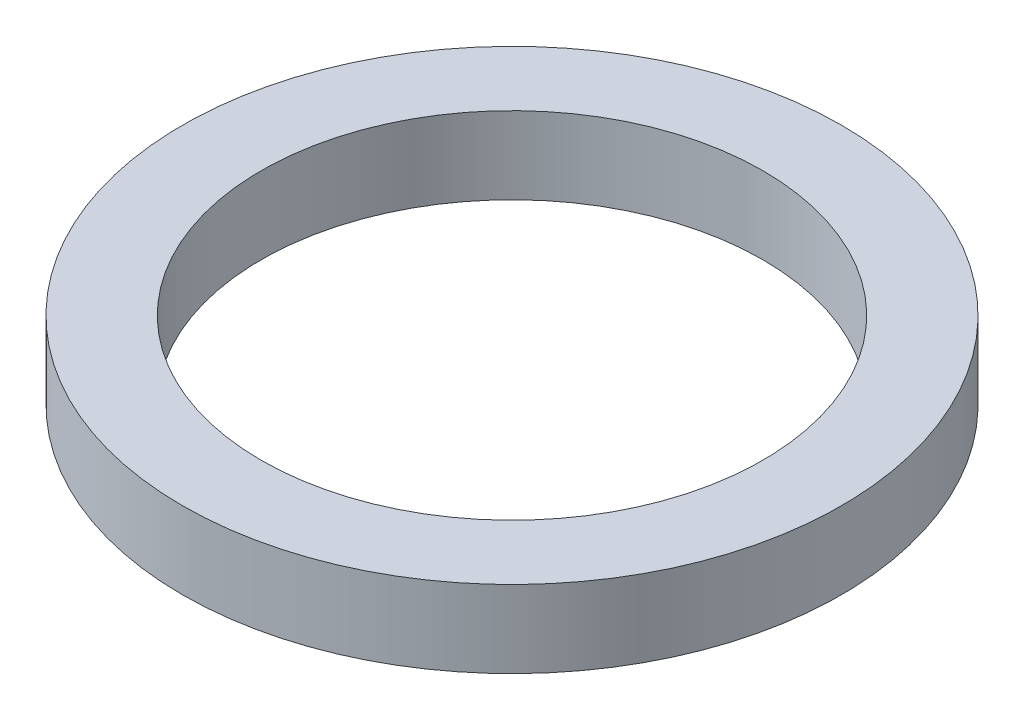
ISO-10303-21;
HEADER;
FILE_DESCRIPTION(('STEP AP214'),'2;1');
FILE_NAME('part.step','',(''),(''),'','','');
FILE_SCHEMA(('AUTOMOTIVE_DESIGN { 1 0 10303 214 1 1 1 1 }'));
ENDSEC;
DATA;
#1=APPLICATION_CONTEXT('core data for automotive mechanical design processes');
#2=APPLICATION_PROTOCOL_DEFINITION('international standard','automotive_design',2000,#1);
#3=PRODUCT_CONTEXT('',#1,'mechanical');
#4=PRODUCT('Part','Part','',(#3));
#5=PRODUCT_RELATED_PRODUCT_CATEGORY('part','',(#4));
#6=PRODUCT_DEFINITION_FORMATION('','',#4);
#7=PRODUCT_DEFINITION_CONTEXT('part definition',#1,'design');
#8=PRODUCT_DEFINITION('design','',#6,#7);
#9=PRODUCT_DEFINITION_SHAPE('','',#8);
#10=(LENGTH_UNIT() NAMED_UNIT(*) SI_UNIT(.MILLI.,.METRE.));
#11=(NAMED_UNIT(*) PLANE_ANGLE_UNIT() SI_UNIT($,.RADIAN.));
#12=(NAMED_UNIT(*) SI_UNIT($,.STERADIAN.) SOLID_ANGLE_UNIT());
#13=UNCERTAINTY_MEASURE_WITH_UNIT(LENGTH_MEASURE(1.E-05),#10,'distance_accuracy_value','');
#14=(GEOMETRIC_REPRESENTATION_CONTEXT(3) GLOBAL_UNCERTAINTY_ASSIGNED_CONTEXT((#13)) GLOBAL_UNIT_ASSIGNED_CONTEXT((#10,
#11,#12)) REPRESENTATION_CONTEXT('',''));
#15=CARTESIAN_POINT('',(0.,0.,0.));
#16=DIRECTION('',(0.,0.,1.));
#17=DIRECTION('',(1.,0.,0.));
#18=AXIS2_PLACEMENT_3D('',#15,#16,#17);
#19=CARTESIAN_POINT('',(0.,6.35,0.));
#20=DIRECTION('',(0.,1.,0.));
#21=DIRECTION('',(0.,0.,1.));
#22=AXIS2_PLACEMENT_3D('',#19,#20,#21);
#23=PLANE('',#22);
#24=CARTESIAN_POINT('',(0.,6.35,0.));
#25=DIRECTION('',(0.,1.,0.));
#26=DIRECTION('',(0.,0.,1.));
#27=AXIS2_PLACEMENT_3D('',#24,#25,#26);
#28=CIRCLE('',#27,27.1145);
#29=CARTESIAN_POINT('',(0.,6.35,27.1145));
#30=VERTEX_POINT('',#29);
#31=EDGE_CURVE('E10',#30,#30,#28,.T.);
#32=ORIENTED_EDGE('',*,*,#31,.T.);
#33=EDGE_LOOP('',(#32));
#34=FACE_BOUND('',#33,.T.);
#35=CARTESIAN_POINT('',(0.,6.35,0.));
#36=DIRECTION('',(0.,1.,0.));
#37=DIRECTION('',(0.,0.,1.));
#38=AXIS2_PLACEMENT_3D('',#35,#36,#37);
#39=CIRCLE('',#38,20.6375);
#40=CARTESIAN_POINT('',(0.,6.35,20.6375));
#41=VERTEX_POINT('',#40);
#42=EDGE_CURVE('E46',#41,#41,#39,.T.);
#43=ORIENTED_EDGE('',*,*,#42,.F.);
#44=EDGE_LOOP('',(#43));
#45=FACE_BOUND('',#44,.T.);
#46=ADVANCED_FACE('F35',(#34,#45),#23,.T.);
#47=CARTESIAN_POINT('',(0.,0.,0.));
#48=DIRECTION('',(0.,1.,0.));
#49=DIRECTION('',(0.,0.,1.));
#50=AXIS2_PLACEMENT_3D('',#47,#48,#49);
#51=PLANE('',#50);
#52=CARTESIAN_POINT('',(0.,0.,0.));
#53=DIRECTION('',(0.,1.,0.));
#54=DIRECTION('',(0.,0.,1.));
#55=AXIS2_PLACEMENT_3D('',#52,#53,#54);
#56=CIRCLE('',#55,27.1145);
#57=CARTESIAN_POINT('',(0.,0.,27.1145));
#58=VERTEX_POINT('',#57);
#59=EDGE_CURVE('E39',#58,#58,#56,.T.);
#60=ORIENTED_EDGE('',*,*,#59,.F.);
#61=EDGE_LOOP('',(#60));
#62=FACE_BOUND('',#61,.T.);
#63=CARTESIAN_POINT('',(0.,0.,0.));
#64=DIRECTION('',(0.,1.,0.));
#65=DIRECTION('',(0.,0.,1.));
#66=AXIS2_PLACEMENT_3D('',#63,#64,#65);
#67=CIRCLE('',#66,20.6375);
#68=CARTESIAN_POINT('',(0.,0.,20.6375));
#69=VERTEX_POINT('',#68);
#70=EDGE_CURVE('E48',#69,#69,#67,.T.);
#71=ORIENTED_EDGE('',*,*,#70,.T.);
#72=EDGE_LOOP('',(#71));
#73=FACE_BOUND('',#72,.T.);
#74=ADVANCED_FACE('F58',(#62,#73),#51,.F.);
#75=CARTESIAN_POINT('',(0.,6.35,0.));
#76=DIRECTION('',(0.,-1.,0.));
#77=DIRECTION('',(0.,0.,-1.));
#78=AXIS2_PLACEMENT_3D('',#75,#76,#77);
#79=CYLINDRICAL_SURFACE('',#78,27.1145);
#80=ORIENTED_EDGE('',*,*,#31,.F.);
#81=EDGE_LOOP('',(#80));
#82=FACE_BOUND('',#81,.T.);
#83=ORIENTED_EDGE('',*,*,#59,.T.);
#84=EDGE_LOOP('',(#83));
#85=FACE_BOUND('',#84,.T.);
#86=ADVANCED_FACE('F37',(#82,#85),#79,.T.);
#87=CARTESIAN_POINT('',(0.,6.35,0.));
#88=DIRECTION('',(0.,-1.,0.));
#89=DIRECTION('',(0.,0.,-1.));
#90=AXIS2_PLACEMENT_3D('',#87,#88,#89);
#91=CYLINDRICAL_SURFACE('',#90,20.6375);
#92=ORIENTED_EDGE('',*,*,#42,.T.);
#93=EDGE_LOOP('',(#92));
#94=FACE_BOUND('',#93,.T.);
#95=ORIENTED_EDGE('',*,*,#70,.F.);
#96=EDGE_LOOP('',(#95));
#97=FACE_BOUND('',#96,.T.);
#98=ADVANCED_FACE('F54',(#94,#97),#91,.F.);
#99=CLOSED_SHELL('',(#46,#74,#86,#98));
#100=MANIFOLD_SOLID_BREP('B2',#99);
#101=ADVANCED_BREP_SHAPE_REPRESENTATION('',(#18,#100),#14);
#102=SHAPE_DEFINITION_REPRESENTATION(#9,#101);
ENDSEC;
END-ISO-10303-21;
